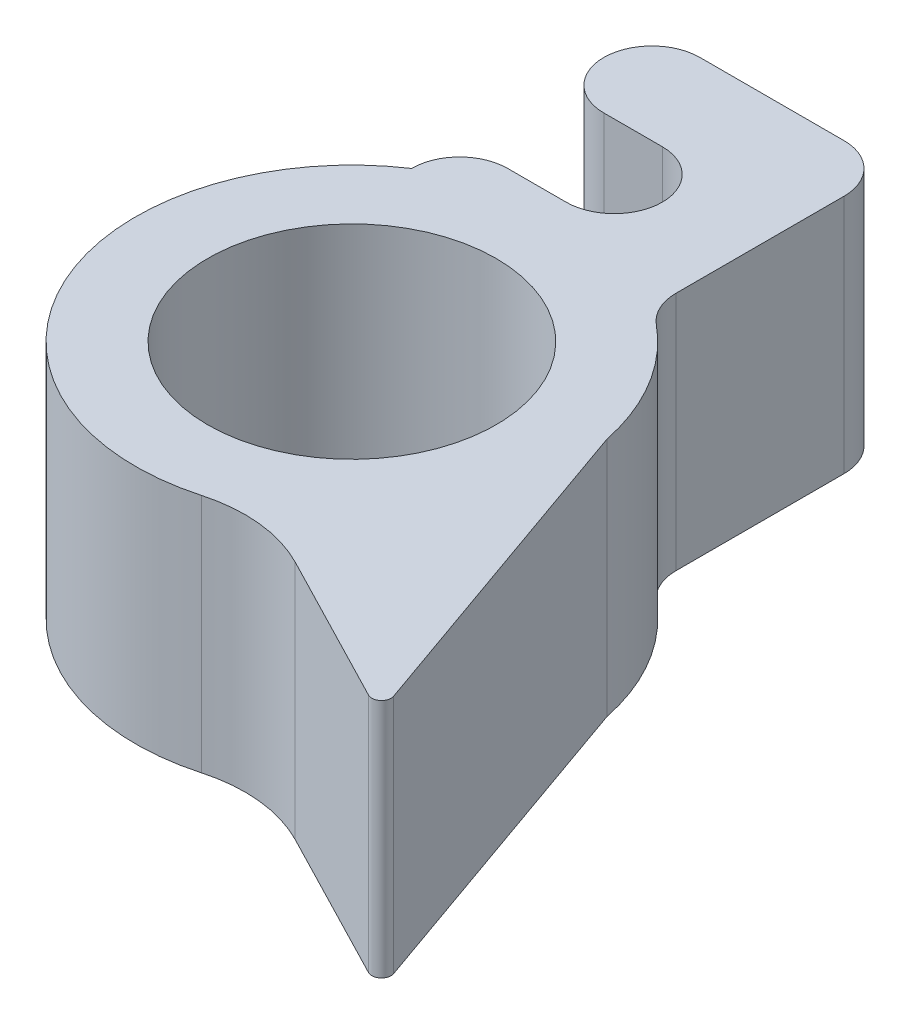
ISO-10303-21;
HEADER;
FILE_DESCRIPTION(('STEP AP214'),'2;1');
FILE_NAME('part.step','',(''),(''),'','','');
FILE_SCHEMA(('AUTOMOTIVE_DESIGN { 1 0 10303 214 1 1 1 1 }'));
ENDSEC;
DATA;
#1=APPLICATION_CONTEXT('core data for automotive mechanical design processes');
#2=APPLICATION_PROTOCOL_DEFINITION('international standard','automotive_design',2000,#1);
#3=PRODUCT_CONTEXT('',#1,'mechanical');
#4=PRODUCT('Part','Part','',(#3));
#5=PRODUCT_RELATED_PRODUCT_CATEGORY('part','',(#4));
#6=PRODUCT_DEFINITION_FORMATION('','',#4);
#7=PRODUCT_DEFINITION_CONTEXT('part definition',#1,'design');
#8=PRODUCT_DEFINITION('design','',#6,#7);
#9=PRODUCT_DEFINITION_SHAPE('','',#8);
#10=(LENGTH_UNIT() NAMED_UNIT(*) SI_UNIT(.MILLI.,.METRE.));
#11=(NAMED_UNIT(*) PLANE_ANGLE_UNIT() SI_UNIT($,.RADIAN.));
#12=(NAMED_UNIT(*) SI_UNIT($,.STERADIAN.) SOLID_ANGLE_UNIT());
#13=UNCERTAINTY_MEASURE_WITH_UNIT(LENGTH_MEASURE(1.E-05),#10,'distance_accuracy_value','');
#14=(GEOMETRIC_REPRESENTATION_CONTEXT(3) GLOBAL_UNCERTAINTY_ASSIGNED_CONTEXT((#13)) GLOBAL_UNIT_ASSIGNED_CONTEXT((#10,
#11,#12)) REPRESENTATION_CONTEXT('',''));
#15=CARTESIAN_POINT('',(0.,0.,0.));
#16=DIRECTION('',(0.,0.,1.));
#17=DIRECTION('',(1.,0.,0.));
#18=AXIS2_PLACEMENT_3D('',#15,#16,#17);
#19=CARTESIAN_POINT('',(0.,6.35,0.));
#20=DIRECTION('',(0.,-1.,0.));
#21=DIRECTION('',(0.,0.,-1.));
#22=AXIS2_PLACEMENT_3D('',#19,#20,#21);
#23=CYLINDRICAL_SURFACE('',#22,5.715);
#24=CARTESIAN_POINT('',(0.,6.35,0.));
#25=DIRECTION('',(0.,1.,0.));
#26=DIRECTION('',(0.,0.,1.));
#27=AXIS2_PLACEMENT_3D('',#24,#25,#26);
#28=CIRCLE('',#27,5.715);
#29=CARTESIAN_POINT('',(-3.175,6.35,-4.7519048812029));
#30=VERTEX_POINT('',#29);
#31=CARTESIAN_POINT('',(1.52784866845138,6.35,5.50698678465014));
#32=VERTEX_POINT('',#31);
#33=EDGE_CURVE('E169',#30,#32,#28,.T.);
#34=ORIENTED_EDGE('',*,*,#33,.F.);
#35=DIRECTION('',(0.,1.,0.));
#36=VECTOR('',#35,1.);
#37=CARTESIAN_POINT('',(-3.175,0.,-4.7519048812029));
#38=LINE('',#37,#36);
#39=CARTESIAN_POINT('',(-3.175,0.,-4.7519048812029));
#40=VERTEX_POINT('',#39);
#41=EDGE_CURVE('E164',#40,#30,#38,.T.);
#42=ORIENTED_EDGE('',*,*,#41,.F.);
#43=CARTESIAN_POINT('',(0.,0.,0.));
#44=DIRECTION('',(0.,1.,0.));
#45=DIRECTION('',(0.,0.,1.));
#46=AXIS2_PLACEMENT_3D('',#43,#44,#45);
#47=CIRCLE('',#46,5.715);
#48=CARTESIAN_POINT('',(1.52784866845138,0.,5.50698678465014));
#49=VERTEX_POINT('',#48);
#50=EDGE_CURVE('E167',#40,#49,#47,.T.);
#51=ORIENTED_EDGE('',*,*,#50,.T.);
#52=DIRECTION('',(0.,-1.,0.));
#53=VECTOR('',#52,1.);
#54=CARTESIAN_POINT('',(1.52784866845138,6.35,5.50698678465014));
#55=LINE('',#54,#53);
#56=EDGE_CURVE('E290',#49,#32,#55,.F.);
#57=ORIENTED_EDGE('',*,*,#56,.T.);
#58=EDGE_LOOP('',(#34,#42,#51,#57));
#59=FACE_BOUND('',#58,.T.);
#60=ADVANCED_FACE('F43',(#59),#23,.T.);
#61=CARTESIAN_POINT('',(5.59952568364628,0.,-1.1430385462379));
#62=VERTEX_POINT('',#61);
#63=CARTESIAN_POINT('',(3.63681818181818,0.,-4.40848936852486));
#64=VERTEX_POINT('',#63);
#65=EDGE_CURVE('E184',#62,#64,#47,.T.);
#66=ORIENTED_EDGE('',*,*,#65,.T.);
#67=DIRECTION('',(0.,-1.,0.));
#68=VECTOR('',#67,1.);
#69=CARTESIAN_POINT('',(3.63681818181818,6.35,-4.40848936852486));
#70=LINE('',#69,#68);
#71=CARTESIAN_POINT('',(3.63681818181818,6.35,-4.40848936852486));
#72=VERTEX_POINT('',#71);
#73=EDGE_CURVE('E278',#64,#72,#70,.F.);
#74=ORIENTED_EDGE('',*,*,#73,.T.);
#75=CARTESIAN_POINT('',(5.59952568364628,6.35,-1.1430385462379));
#76=VERTEX_POINT('',#75);
#77=EDGE_CURVE('E305',#76,#72,#28,.T.);
#78=ORIENTED_EDGE('',*,*,#77,.F.);
#79=DIRECTION('',(0.,-1.,0.));
#80=VECTOR('',#79,1.);
#81=CARTESIAN_POINT('',(5.59952568364628,6.35,-1.14303854623788));
#82=LINE('',#81,#80);
#83=EDGE_CURVE('E316',#62,#76,#82,.F.);
#84=ORIENTED_EDGE('',*,*,#83,.F.);
#85=EDGE_LOOP('',(#66,#74,#78,#84));
#86=FACE_BOUND('',#85,.T.);
#87=ADVANCED_FACE('F387',(#86),#23,.T.);
#88=CARTESIAN_POINT('',(0.,6.35,0.));
#89=DIRECTION('',(0.,1.,0.));
#90=DIRECTION('',(0.,0.,1.));
#91=AXIS2_PLACEMENT_3D('',#88,#89,#90);
#92=PLANE('',#91);
#93=DIRECTION('',(1.,0.,0.));
#94=VECTOR('',#93,1.);
#95=CARTESIAN_POINT('',(-3.175,6.35,-6.0219048812029));
#96=LINE('',#95,#94);
#97=CARTESIAN_POINT('',(-1.905,6.35,-6.0219048812029));
#98=VERTEX_POINT('',#97);
#99=CARTESIAN_POINT('',(-0.359574913694108,6.35,-6.0219048812029));
#100=VERTEX_POINT('',#99);
#101=EDGE_CURVE('E227',#98,#100,#96,.T.);
#102=ORIENTED_EDGE('',*,*,#101,.F.);
#103=CARTESIAN_POINT('',(-1.905,6.35,-4.7519048812029));
#104=DIRECTION('',(0.,1.,0.));
#105=DIRECTION('',(0.,0.,1.));
#106=AXIS2_PLACEMENT_3D('',#103,#104,#105);
#107=CIRCLE('',#106,1.27);
#108=EDGE_CURVE('E253',#98,#30,#107,.T.);
#109=ORIENTED_EDGE('',*,*,#108,.T.);
#110=ORIENTED_EDGE('',*,*,#33,.T.);
#111=CARTESIAN_POINT('',(2.54641444741897,6.35,9.17831130775024));
#112=DIRECTION('',(0.,1.,0.));
#113=DIRECTION('',(0.,0.,1.));
#114=AXIS2_PLACEMENT_3D('',#111,#112,#113);
#115=CIRCLE('',#114,3.81);
#116=CARTESIAN_POINT('',(4.29654066535961,6.35,5.79405980686015));
#117=VERTEX_POINT('',#116);
#118=EDGE_CURVE('E284',#32,#117,#115,.F.);
#119=ORIENTED_EDGE('',*,*,#118,.T.);
#120=DIRECTION('',(-0.888254987110259,0.,-0.459350713370246));
#121=VECTOR('',#120,1.);
#122=CARTESIAN_POINT('',(8.87692141777041,6.35,8.16275032552771));
#123=LINE('',#122,#121);
#124=CARTESIAN_POINT('',(8.30784884123121,6.35,7.868461075497));
#125=VERTEX_POINT('',#124);
#126=EDGE_CURVE('E173',#125,#117,#123,.T.);
#127=ORIENTED_EDGE('',*,*,#126,.F.);
#128=CARTESIAN_POINT('',(8.42452392242726,6.35,7.64284430877099));
#129=DIRECTION('',(0.,1.,0.));
#130=DIRECTION('',(0.,0.,1.));
#131=AXIS2_PLACEMENT_3D('',#128,#129,#130);
#132=CIRCLE('',#131,0.254);
#133=CARTESIAN_POINT('',(8.66409997571159,6.35,7.55846827726498));
#134=VERTEX_POINT('',#133);
#135=EDGE_CURVE('E299',#125,#134,#132,.T.);
#136=ORIENTED_EDGE('',*,*,#135,.T.);
#137=DIRECTION('',(0.332189100417359,0.,0.943212808206031));
#138=VECTOR('',#137,1.);
#139=CARTESIAN_POINT('',(5.08,6.35,-2.61817207226721));
#140=LINE('',#139,#138);
#141=EDGE_CURVE('E324',#76,#134,#140,.T.);
#142=ORIENTED_EDGE('',*,*,#141,.F.);
#143=ORIENTED_EDGE('',*,*,#77,.T.);
#144=CARTESIAN_POINT('',(4.445,6.35,-5.38815367264149));
#145=DIRECTION('',(0.,1.,0.));
#146=DIRECTION('',(0.,0.,1.));
#147=AXIS2_PLACEMENT_3D('',#144,#145,#146);
#148=CIRCLE('',#147,1.27);
#149=CARTESIAN_POINT('',(3.175,6.35,-5.38815367264149));
#150=VERTEX_POINT('',#149);
#151=EDGE_CURVE('E212',#72,#150,#148,.F.);
#152=ORIENTED_EDGE('',*,*,#151,.T.);
#153=DIRECTION('',(0.,0.,-1.));
#154=VECTOR('',#153,1.);
#155=CARTESIAN_POINT('',(3.175,6.35,-4.7519048812029));
#156=LINE('',#155,#154);
#157=CARTESIAN_POINT('',(3.175,6.35,-9.8319048812029));
#158=VERTEX_POINT('',#157);
#159=EDGE_CURVE('E342',#150,#158,#156,.T.);
#160=ORIENTED_EDGE('',*,*,#159,.T.);
#161=CARTESIAN_POINT('',(1.905,6.35,-9.8319048812029));
#162=DIRECTION('',(0.,1.,0.));
#163=DIRECTION('',(0.,0.,1.));
#164=AXIS2_PLACEMENT_3D('',#161,#162,#163);
#165=CIRCLE('',#164,1.27);
#166=CARTESIAN_POINT('',(1.905,6.35,-11.1019048812029));
#167=VERTEX_POINT('',#166);
#168=EDGE_CURVE('E262',#158,#167,#165,.T.);
#169=ORIENTED_EDGE('',*,*,#168,.T.);
#170=DIRECTION('',(-1.,0.,0.));
#171=VECTOR('',#170,1.);
#172=CARTESIAN_POINT('',(-3.175,6.35,-11.1019048812029));
#173=LINE('',#172,#171);
#174=CARTESIAN_POINT('',(-1.905,6.35,-11.1019048812029));
#175=VERTEX_POINT('',#174);
#176=EDGE_CURVE('E337',#167,#175,#173,.T.);
#177=ORIENTED_EDGE('',*,*,#176,.T.);
#178=CARTESIAN_POINT('',(-1.905,6.35,-9.8319048812029));
#179=DIRECTION('',(0.,1.,0.));
#180=DIRECTION('',(0.,0.,1.));
#181=AXIS2_PLACEMENT_3D('',#178,#179,#180);
#182=CIRCLE('',#181,1.27);
#183=CARTESIAN_POINT('',(-3.175,6.35,-9.8319048812029));
#184=VERTEX_POINT('',#183);
#185=EDGE_CURVE('E247',#175,#184,#182,.T.);
#186=ORIENTED_EDGE('',*,*,#185,.T.);
#187=CARTESIAN_POINT('',(-1.905,6.35,-9.8319048812029));
#188=DIRECTION('',(0.,1.,0.));
#189=DIRECTION('',(0.,0.,1.));
#190=AXIS2_PLACEMENT_3D('',#187,#188,#189);
#191=CIRCLE('',#190,1.27);
#192=CARTESIAN_POINT('',(-1.905,6.35,-8.5619048812029));
#193=VERTEX_POINT('',#192);
#194=EDGE_CURVE('E241',#184,#193,#191,.T.);
#195=ORIENTED_EDGE('',*,*,#194,.T.);
#196=DIRECTION('',(-1.,0.,0.));
#197=VECTOR('',#196,1.);
#198=CARTESIAN_POINT('',(-3.175,6.35,-8.5619048812029));
#199=LINE('',#198,#197);
#200=CARTESIAN_POINT('',(-0.359574913694109,6.35,-8.5619048812029));
#201=VERTEX_POINT('',#200);
#202=EDGE_CURVE('E233',#201,#193,#199,.T.);
#203=ORIENTED_EDGE('',*,*,#202,.F.);
#204=CARTESIAN_POINT('',(-0.359574913694109,6.35,-7.29190488120291));
#205=DIRECTION('',(0.,1.,0.));
#206=DIRECTION('',(0.,0.,1.));
#207=AXIS2_PLACEMENT_3D('',#204,#205,#206);
#208=CIRCLE('',#207,1.27);
#209=CARTESIAN_POINT('',(0.910425086305891,6.35,-7.2919048812029));
#210=VERTEX_POINT('',#209);
#211=EDGE_CURVE('E53',#201,#210,#208,.F.);
#212=ORIENTED_EDGE('',*,*,#211,.T.);
#213=CARTESIAN_POINT('',(-0.359574913694108,6.35,-7.2919048812029));
#214=DIRECTION('',(0.,1.,0.));
#215=DIRECTION('',(0.,0.,1.));
#216=AXIS2_PLACEMENT_3D('',#213,#214,#215);
#217=CIRCLE('',#216,1.27);
#218=EDGE_CURVE('E218',#210,#100,#217,.F.);
#219=ORIENTED_EDGE('',*,*,#218,.T.);
#220=EDGE_LOOP('',(#102,#109,#110,#119,#127,#136,#142,#143,#152,#160,#169,#177,#186,#195,#203,
#212,#219));
#221=FACE_BOUND('',#220,.T.);
#222=CARTESIAN_POINT('',(0.,6.35,0.));
#223=DIRECTION('',(0.,1.,0.));
#224=DIRECTION('',(0.,0.,1.));
#225=AXIS2_PLACEMENT_3D('',#222,#223,#224);
#226=CIRCLE('',#225,3.81);
#227=CARTESIAN_POINT('',(0.,6.35,3.81));
#228=VERTEX_POINT('',#227);
#229=EDGE_CURVE('E312',#228,#228,#226,.T.);
#230=ORIENTED_EDGE('',*,*,#229,.F.);
#231=EDGE_LOOP('',(#230));
#232=FACE_BOUND('',#231,.T.);
#233=ADVANCED_FACE('F365',(#221,#232),#92,.T.);
#234=CARTESIAN_POINT('',(0.,0.,0.));
#235=DIRECTION('',(0.,1.,0.));
#236=DIRECTION('',(0.,0.,1.));
#237=AXIS2_PLACEMENT_3D('',#234,#235,#236);
#238=PLANE('',#237);
#239=CARTESIAN_POINT('',(0.,0.,0.));
#240=DIRECTION('',(0.,1.,0.));
#241=DIRECTION('',(0.,0.,1.));
#242=AXIS2_PLACEMENT_3D('',#239,#240,#241);
#243=CIRCLE('',#242,3.81);
#244=CARTESIAN_POINT('',(0.,0.,3.81));
#245=VERTEX_POINT('',#244);
#246=EDGE_CURVE('E185',#245,#245,#243,.T.);
#247=ORIENTED_EDGE('',*,*,#246,.T.);
#248=EDGE_LOOP('',(#247));
#249=FACE_BOUND('',#248,.T.);
#250=ORIENTED_EDGE('',*,*,#50,.F.);
#251=CARTESIAN_POINT('',(-1.905,0.,-4.7519048812029));
#252=DIRECTION('',(0.,1.,0.));
#253=DIRECTION('',(0.,0.,1.));
#254=AXIS2_PLACEMENT_3D('',#251,#252,#253);
#255=CIRCLE('',#254,1.27);
#256=CARTESIAN_POINT('',(-1.905,0.,-6.0219048812029));
#257=VERTEX_POINT('',#256);
#258=EDGE_CURVE('E177',#40,#257,#255,.F.);
#259=ORIENTED_EDGE('',*,*,#258,.T.);
#260=DIRECTION('',(1.,0.,0.));
#261=VECTOR('',#260,1.);
#262=CARTESIAN_POINT('',(-3.175,0.,-6.0219048812029));
#263=LINE('',#262,#261);
#264=CARTESIAN_POINT('',(-0.359574913694108,0.,-6.0219048812029));
#265=VERTEX_POINT('',#264);
#266=EDGE_CURVE('E354',#257,#265,#263,.T.);
#267=ORIENTED_EDGE('',*,*,#266,.T.);
#268=CARTESIAN_POINT('',(-0.359574913694108,0.,-7.2919048812029));
#269=DIRECTION('',(0.,1.,0.));
#270=DIRECTION('',(0.,0.,1.));
#271=AXIS2_PLACEMENT_3D('',#268,#269,#270);
#272=CIRCLE('',#271,1.27);
#273=CARTESIAN_POINT('',(0.910425086305891,0.,-7.2919048812029));
#274=VERTEX_POINT('',#273);
#275=EDGE_CURVE('E60',#265,#274,#272,.T.);
#276=ORIENTED_EDGE('',*,*,#275,.T.);
#277=CARTESIAN_POINT('',(-0.359574913694109,0.,-7.29190488120291));
#278=DIRECTION('',(0.,1.,0.));
#279=DIRECTION('',(0.,0.,1.));
#280=AXIS2_PLACEMENT_3D('',#277,#278,#279);
#281=CIRCLE('',#280,1.27);
#282=CARTESIAN_POINT('',(-0.359574913694109,0.,-8.5619048812029));
#283=VERTEX_POINT('',#282);
#284=EDGE_CURVE('E11',#274,#283,#281,.T.);
#285=ORIENTED_EDGE('',*,*,#284,.T.);
#286=DIRECTION('',(-1.,0.,0.));
#287=VECTOR('',#286,1.);
#288=CARTESIAN_POINT('',(-3.175,0.,-8.5619048812029));
#289=LINE('',#288,#287);
#290=CARTESIAN_POINT('',(-1.905,0.,-8.5619048812029));
#291=VERTEX_POINT('',#290);
#292=EDGE_CURVE('E346',#283,#291,#289,.T.);
#293=ORIENTED_EDGE('',*,*,#292,.T.);
#294=CARTESIAN_POINT('',(-1.905,0.,-9.8319048812029));
#295=DIRECTION('',(0.,1.,0.));
#296=DIRECTION('',(0.,0.,1.));
#297=AXIS2_PLACEMENT_3D('',#294,#295,#296);
#298=CIRCLE('',#297,1.27);
#299=CARTESIAN_POINT('',(-3.175,0.,-9.8319048812029));
#300=VERTEX_POINT('',#299);
#301=EDGE_CURVE('E193',#291,#300,#298,.F.);
#302=ORIENTED_EDGE('',*,*,#301,.T.);
#303=CARTESIAN_POINT('',(-1.905,0.,-9.8319048812029));
#304=DIRECTION('',(0.,1.,0.));
#305=DIRECTION('',(0.,0.,1.));
#306=AXIS2_PLACEMENT_3D('',#303,#304,#305);
#307=CIRCLE('',#306,1.27);
#308=CARTESIAN_POINT('',(-1.905,0.,-11.1019048812029));
#309=VERTEX_POINT('',#308);
#310=EDGE_CURVE('E200',#300,#309,#307,.F.);
#311=ORIENTED_EDGE('',*,*,#310,.T.);
#312=DIRECTION('',(-1.,0.,0.));
#313=VECTOR('',#312,1.);
#314=CARTESIAN_POINT('',(-3.175,0.,-11.1019048812029));
#315=LINE('',#314,#313);
#316=CARTESIAN_POINT('',(1.905,0.,-11.1019048812029));
#317=VERTEX_POINT('',#316);
#318=EDGE_CURVE('E174',#317,#309,#315,.T.);
#319=ORIENTED_EDGE('',*,*,#318,.F.);
#320=CARTESIAN_POINT('',(1.905,0.,-9.8319048812029));
#321=DIRECTION('',(0.,1.,0.));
#322=DIRECTION('',(0.,0.,1.));
#323=AXIS2_PLACEMENT_3D('',#320,#321,#322);
#324=CIRCLE('',#323,1.27);
#325=CARTESIAN_POINT('',(3.175,0.,-9.8319048812029));
#326=VERTEX_POINT('',#325);
#327=EDGE_CURVE('E251',#317,#326,#324,.F.);
#328=ORIENTED_EDGE('',*,*,#327,.T.);
#329=DIRECTION('',(0.,0.,-1.));
#330=VECTOR('',#329,1.);
#331=CARTESIAN_POINT('',(3.175,0.,-4.7519048812029));
#332=LINE('',#331,#330);
#333=CARTESIAN_POINT('',(3.175,0.,-5.38815367264149));
#334=VERTEX_POINT('',#333);
#335=EDGE_CURVE('E341',#334,#326,#332,.T.);
#336=ORIENTED_EDGE('',*,*,#335,.F.);
#337=CARTESIAN_POINT('',(4.445,0.,-5.38815367264149));
#338=DIRECTION('',(0.,1.,0.));
#339=DIRECTION('',(0.,0.,1.));
#340=AXIS2_PLACEMENT_3D('',#337,#338,#339);
#341=CIRCLE('',#340,1.27);
#342=EDGE_CURVE('E215',#334,#64,#341,.T.);
#343=ORIENTED_EDGE('',*,*,#342,.T.);
#344=ORIENTED_EDGE('',*,*,#65,.F.);
#345=DIRECTION('',(0.332189100417359,0.,0.943212808206031));
#346=VECTOR('',#345,1.);
#347=CARTESIAN_POINT('',(5.08,0.,-2.61817207226721));
#348=LINE('',#347,#346);
#349=CARTESIAN_POINT('',(8.66409997571159,0.,7.55846827726498));
#350=VERTEX_POINT('',#349);
#351=EDGE_CURVE('E323',#62,#350,#348,.T.);
#352=ORIENTED_EDGE('',*,*,#351,.T.);
#353=CARTESIAN_POINT('',(8.42452392242726,0.,7.64284430877099));
#354=DIRECTION('',(0.,1.,0.));
#355=DIRECTION('',(0.,0.,1.));
#356=AXIS2_PLACEMENT_3D('',#353,#354,#355);
#357=CIRCLE('',#356,0.254);
#358=CARTESIAN_POINT('',(8.30784884123121,0.,7.868461075497));
#359=VERTEX_POINT('',#358);
#360=EDGE_CURVE('E293',#350,#359,#357,.F.);
#361=ORIENTED_EDGE('',*,*,#360,.T.);
#362=DIRECTION('',(-0.888254987110259,0.,-0.459350713370246));
#363=VECTOR('',#362,1.);
#364=CARTESIAN_POINT('',(8.87692141777041,0.,8.16275032552771));
#365=LINE('',#364,#363);
#366=CARTESIAN_POINT('',(4.29654066535961,0.,5.79405980686015));
#367=VERTEX_POINT('',#366);
#368=EDGE_CURVE('E328',#359,#367,#365,.T.);
#369=ORIENTED_EDGE('',*,*,#368,.T.);
#370=CARTESIAN_POINT('',(2.54641444741897,0.,9.17831130775024));
#371=DIRECTION('',(0.,1.,0.));
#372=DIRECTION('',(0.,0.,1.));
#373=AXIS2_PLACEMENT_3D('',#370,#371,#372);
#374=CIRCLE('',#373,3.81);
#375=EDGE_CURVE('E181',#367,#49,#374,.T.);
#376=ORIENTED_EDGE('',*,*,#375,.T.);
#377=EDGE_LOOP('',(#250,#259,#267,#276,#285,#293,#302,#311,#319,#328,#336,#343,#344,#352,#361,
#369,#376));
#378=FACE_BOUND('',#377,.T.);
#379=ADVANCED_FACE('F176',(#249,#378),#238,.F.);
#380=CARTESIAN_POINT('',(0.,0.,0.));
#381=DIRECTION('',(0.,1.,0.));
#382=DIRECTION('',(0.,0.,1.));
#383=AXIS2_PLACEMENT_3D('',#380,#381,#382);
#384=CYLINDRICAL_SURFACE('',#383,3.81);
#385=ORIENTED_EDGE('',*,*,#246,.F.);
#386=EDGE_LOOP('',(#385));
#387=FACE_BOUND('',#386,.T.);
#388=ORIENTED_EDGE('',*,*,#229,.T.);
#389=EDGE_LOOP('',(#388));
#390=FACE_BOUND('',#389,.T.);
#391=ADVANCED_FACE('F530',(#387,#390),#384,.F.);
#392=CARTESIAN_POINT('',(5.08,0.,-2.61817207226721));
#393=DIRECTION('',(-0.94321280820603,0.,0.332189100417359));
#394=DIRECTION('',(0.332189100417359,0.,0.943212808206031));
#395=AXIS2_PLACEMENT_3D('',#392,#393,#394);
#396=PLANE('',#395);
#397=ORIENTED_EDGE('',*,*,#141,.T.);
#398=DIRECTION('',(0.,1.,0.));
#399=VECTOR('',#398,1.);
#400=CARTESIAN_POINT('',(8.66409997571159,0.,7.55846827726498));
#401=LINE('',#400,#399);
#402=EDGE_CURVE('E296',#134,#350,#401,.F.);
#403=ORIENTED_EDGE('',*,*,#402,.T.);
#404=ORIENTED_EDGE('',*,*,#351,.F.);
#405=ORIENTED_EDGE('',*,*,#83,.T.);
#406=EDGE_LOOP('',(#397,#403,#404,#405));
#407=FACE_BOUND('',#406,.T.);
#408=ADVANCED_FACE('F383',(#407),#396,.F.);
#409=CARTESIAN_POINT('',(8.87692141777041,0.,8.16275032552771));
#410=DIRECTION('',(0.459350713370246,0.,-0.888254987110259));
#411=DIRECTION('',(-0.888254987110259,0.,-0.459350713370246));
#412=AXIS2_PLACEMENT_3D('',#409,#410,#411);
#413=PLANE('',#412);
#414=ORIENTED_EDGE('',*,*,#126,.T.);
#415=DIRECTION('',(0.,1.,0.));
#416=VECTOR('',#415,1.);
#417=CARTESIAN_POINT('',(4.29654066535961,0.,5.79405980686015));
#418=LINE('',#417,#416);
#419=EDGE_CURVE('E287',#117,#367,#418,.F.);
#420=ORIENTED_EDGE('',*,*,#419,.T.);
#421=ORIENTED_EDGE('',*,*,#368,.F.);
#422=DIRECTION('',(0.,1.,0.));
#423=VECTOR('',#422,1.);
#424=CARTESIAN_POINT('',(8.30784884123121,0.,7.868461075497));
#425=LINE('',#424,#423);
#426=EDGE_CURVE('E302',#359,#125,#425,.T.);
#427=ORIENTED_EDGE('',*,*,#426,.T.);
#428=EDGE_LOOP('',(#414,#420,#421,#427));
#429=FACE_BOUND('',#428,.T.);
#430=ADVANCED_FACE('F375',(#429),#413,.F.);
#431=CARTESIAN_POINT('',(8.42452392242726,0.,7.64284430877099));
#432=DIRECTION('',(0.,1.,0.));
#433=DIRECTION('',(0.,0.,1.));
#434=AXIS2_PLACEMENT_3D('',#431,#432,#433);
#435=CYLINDRICAL_SURFACE('',#434,0.254);
#436=ORIENTED_EDGE('',*,*,#360,.F.);
#437=ORIENTED_EDGE('',*,*,#402,.F.);
#438=ORIENTED_EDGE('',*,*,#135,.F.);
#439=ORIENTED_EDGE('',*,*,#426,.F.);
#440=EDGE_LOOP('',(#436,#437,#438,#439));
#441=FACE_BOUND('',#440,.T.);
#442=ADVANCED_FACE('F381',(#441),#435,.T.);
#443=CARTESIAN_POINT('',(2.54641444741897,6.35,9.17831130775024));
#444=DIRECTION('',(0.,-1.,0.));
#445=DIRECTION('',(0.,0.,-1.));
#446=AXIS2_PLACEMENT_3D('',#443,#444,#445);
#447=CYLINDRICAL_SURFACE('',#446,3.81);
#448=ORIENTED_EDGE('',*,*,#375,.F.);
#449=ORIENTED_EDGE('',*,*,#419,.F.);
#450=ORIENTED_EDGE('',*,*,#118,.F.);
#451=ORIENTED_EDGE('',*,*,#56,.F.);
#452=EDGE_LOOP('',(#448,#449,#450,#451));
#453=FACE_BOUND('',#452,.T.);
#454=ADVANCED_FACE('F372',(#453),#447,.F.);
#455=CARTESIAN_POINT('',(-3.175,0.,-11.1019048812029));
#456=DIRECTION('',(0.,0.,-1.));
#457=DIRECTION('',(-1.,0.,0.));
#458=AXIS2_PLACEMENT_3D('',#455,#456,#457);
#459=PLANE('',#458);
#460=ORIENTED_EDGE('',*,*,#318,.T.);
#461=DIRECTION('',(0.,1.,0.));
#462=VECTOR('',#461,1.);
#463=CARTESIAN_POINT('',(-1.905,0.,-11.1019048812029));
#464=LINE('',#463,#462);
#465=EDGE_CURVE('E209',#309,#175,#464,.T.);
#466=ORIENTED_EDGE('',*,*,#465,.T.);
#467=ORIENTED_EDGE('',*,*,#176,.F.);
#468=DIRECTION('',(0.,1.,0.));
#469=VECTOR('',#468,1.);
#470=CARTESIAN_POINT('',(1.905,0.,-11.1019048812029));
#471=LINE('',#470,#469);
#472=EDGE_CURVE('E206',#167,#317,#471,.F.);
#473=ORIENTED_EDGE('',*,*,#472,.T.);
#474=EDGE_LOOP('',(#460,#466,#467,#473));
#475=FACE_BOUND('',#474,.T.);
#476=ADVANCED_FACE('F403',(#475),#459,.T.);
#477=CARTESIAN_POINT('',(3.175,0.,-4.7519048812029));
#478=DIRECTION('',(1.,0.,0.));
#479=DIRECTION('',(0.,0.,-1.));
#480=AXIS2_PLACEMENT_3D('',#477,#478,#479);
#481=PLANE('',#480);
#482=ORIENTED_EDGE('',*,*,#159,.F.);
#483=DIRECTION('',(0.,-1.,0.));
#484=VECTOR('',#483,1.);
#485=CARTESIAN_POINT('',(3.175,0.,-5.38815367264149));
#486=LINE('',#485,#484);
#487=EDGE_CURVE('E271',#150,#334,#486,.T.);
#488=ORIENTED_EDGE('',*,*,#487,.T.);
#489=ORIENTED_EDGE('',*,*,#335,.T.);
#490=DIRECTION('',(0.,1.,0.));
#491=VECTOR('',#490,1.);
#492=CARTESIAN_POINT('',(3.175,0.,-9.8319048812029));
#493=LINE('',#492,#491);
#494=EDGE_CURVE('E274',#326,#158,#493,.T.);
#495=ORIENTED_EDGE('',*,*,#494,.T.);
#496=EDGE_LOOP('',(#482,#488,#489,#495));
#497=FACE_BOUND('',#496,.T.);
#498=ADVANCED_FACE('F393',(#497),#481,.T.);
#499=CARTESIAN_POINT('',(-3.175,0.,-8.5619048812029));
#500=DIRECTION('',(0.,0.,-1.));
#501=DIRECTION('',(-1.,0.,0.));
#502=AXIS2_PLACEMENT_3D('',#499,#500,#501);
#503=PLANE('',#502);
#504=ORIENTED_EDGE('',*,*,#292,.F.);
#505=DIRECTION('',(0.,1.,0.));
#506=VECTOR('',#505,1.);
#507=CARTESIAN_POINT('',(-0.359574913694109,6.35,-8.5619048812029));
#508=LINE('',#507,#506);
#509=EDGE_CURVE('E198',#283,#201,#508,.T.);
#510=ORIENTED_EDGE('',*,*,#509,.T.);
#511=ORIENTED_EDGE('',*,*,#202,.T.);
#512=DIRECTION('',(0.,1.,0.));
#513=VECTOR('',#512,1.);
#514=CARTESIAN_POINT('',(-1.905,0.,-8.5619048812029));
#515=LINE('',#514,#513);
#516=EDGE_CURVE('E192',#193,#291,#515,.F.);
#517=ORIENTED_EDGE('',*,*,#516,.T.);
#518=EDGE_LOOP('',(#504,#510,#511,#517));
#519=FACE_BOUND('',#518,.T.);
#520=ADVANCED_FACE('F410',(#519),#503,.F.);
#521=CARTESIAN_POINT('',(-3.175,0.,-6.0219048812029));
#522=DIRECTION('',(0.,0.,1.));
#523=DIRECTION('',(1.,0.,0.));
#524=AXIS2_PLACEMENT_3D('',#521,#522,#523);
#525=PLANE('',#524);
#526=ORIENTED_EDGE('',*,*,#266,.F.);
#527=DIRECTION('',(0.,1.,0.));
#528=VECTOR('',#527,1.);
#529=CARTESIAN_POINT('',(-1.905,6.35,-6.0219048812029));
#530=LINE('',#529,#528);
#531=EDGE_CURVE('E190',#257,#98,#530,.T.);
#532=ORIENTED_EDGE('',*,*,#531,.T.);
#533=ORIENTED_EDGE('',*,*,#101,.T.);
#534=DIRECTION('',(0.,1.,0.));
#535=VECTOR('',#534,1.);
#536=CARTESIAN_POINT('',(-0.359574913694108,0.,-6.0219048812029));
#537=LINE('',#536,#535);
#538=EDGE_CURVE('E267',#100,#265,#537,.F.);
#539=ORIENTED_EDGE('',*,*,#538,.T.);
#540=EDGE_LOOP('',(#526,#532,#533,#539));
#541=FACE_BOUND('',#540,.T.);
#542=ADVANCED_FACE('F361',(#541),#525,.F.);
#543=CARTESIAN_POINT('',(4.445,6.35,-5.38815367264149));
#544=DIRECTION('',(0.,-1.,0.));
#545=DIRECTION('',(0.,0.,-1.));
#546=AXIS2_PLACEMENT_3D('',#543,#544,#545);
#547=CYLINDRICAL_SURFACE('',#546,1.27);
#548=ORIENTED_EDGE('',*,*,#342,.F.);
#549=ORIENTED_EDGE('',*,*,#487,.F.);
#550=ORIENTED_EDGE('',*,*,#151,.F.);
#551=ORIENTED_EDGE('',*,*,#73,.F.);
#552=EDGE_LOOP('',(#548,#549,#550,#551));
#553=FACE_BOUND('',#552,.T.);
#554=ADVANCED_FACE('F397',(#553),#547,.F.);
#555=CARTESIAN_POINT('',(-1.905,0.,-4.7519048812029));
#556=DIRECTION('',(0.,-1.,0.));
#557=DIRECTION('',(0.,0.,-1.));
#558=AXIS2_PLACEMENT_3D('',#555,#556,#557);
#559=CYLINDRICAL_SURFACE('',#558,1.27);
#560=ORIENTED_EDGE('',*,*,#258,.F.);
#561=ORIENTED_EDGE('',*,*,#41,.T.);
#562=ORIENTED_EDGE('',*,*,#108,.F.);
#563=ORIENTED_EDGE('',*,*,#531,.F.);
#564=EDGE_LOOP('',(#560,#561,#562,#563));
#565=FACE_BOUND('',#564,.T.);
#566=ADVANCED_FACE('F188',(#565),#559,.T.);
#567=CARTESIAN_POINT('',(-0.359574913694109,0.,-7.29190488120291));
#568=DIRECTION('',(0.,-1.,0.));
#569=DIRECTION('',(0.,0.,-1.));
#570=AXIS2_PLACEMENT_3D('',#567,#568,#569);
#571=CYLINDRICAL_SURFACE('',#570,1.27);
#572=ORIENTED_EDGE('',*,*,#509,.F.);
#573=ORIENTED_EDGE('',*,*,#284,.F.);
#574=DIRECTION('',(0.,1.,0.));
#575=VECTOR('',#574,1.);
#576=CARTESIAN_POINT('',(0.910425086305891,0.,-7.29190488120291));
#577=LINE('',#576,#575);
#578=EDGE_CURVE('E224',#210,#274,#577,.F.);
#579=ORIENTED_EDGE('',*,*,#578,.F.);
#580=ORIENTED_EDGE('',*,*,#211,.F.);
#581=EDGE_LOOP('',(#572,#573,#579,#580));
#582=FACE_BOUND('',#581,.T.);
#583=ADVANCED_FACE('F430',(#582),#571,.F.);
#584=CARTESIAN_POINT('',(-0.359574913694108,0.,-7.2919048812029));
#585=DIRECTION('',(0.,-1.,0.));
#586=DIRECTION('',(0.,0.,-1.));
#587=AXIS2_PLACEMENT_3D('',#584,#585,#586);
#588=CYLINDRICAL_SURFACE('',#587,1.27);
#589=ORIENTED_EDGE('',*,*,#275,.F.);
#590=ORIENTED_EDGE('',*,*,#538,.F.);
#591=ORIENTED_EDGE('',*,*,#218,.F.);
#592=ORIENTED_EDGE('',*,*,#578,.T.);
#593=EDGE_LOOP('',(#589,#590,#591,#592));
#594=FACE_BOUND('',#593,.T.);
#595=ADVANCED_FACE('F364',(#594),#588,.F.);
#596=CARTESIAN_POINT('',(-1.905,0.,-9.8319048812029));
#597=DIRECTION('',(0.,1.,0.));
#598=DIRECTION('',(0.,0.,1.));
#599=AXIS2_PLACEMENT_3D('',#596,#597,#598);
#600=CYLINDRICAL_SURFACE('',#599,1.27);
#601=ORIENTED_EDGE('',*,*,#465,.F.);
#602=ORIENTED_EDGE('',*,*,#310,.F.);
#603=DIRECTION('',(0.,1.,0.));
#604=VECTOR('',#603,1.);
#605=CARTESIAN_POINT('',(-3.175,0.,-9.8319048812029));
#606=LINE('',#605,#604);
#607=EDGE_CURVE('E47',#184,#300,#606,.F.);
#608=ORIENTED_EDGE('',*,*,#607,.F.);
#609=ORIENTED_EDGE('',*,*,#185,.F.);
#610=EDGE_LOOP('',(#601,#602,#608,#609));
#611=FACE_BOUND('',#610,.T.);
#612=ADVANCED_FACE('F246',(#611),#600,.T.);
#613=CARTESIAN_POINT('',(-1.905,0.,-9.8319048812029));
#614=DIRECTION('',(0.,-1.,0.));
#615=DIRECTION('',(0.,0.,-1.));
#616=AXIS2_PLACEMENT_3D('',#613,#614,#615);
#617=CYLINDRICAL_SURFACE('',#616,1.27);
#618=ORIENTED_EDGE('',*,*,#301,.F.);
#619=ORIENTED_EDGE('',*,*,#516,.F.);
#620=ORIENTED_EDGE('',*,*,#194,.F.);
#621=ORIENTED_EDGE('',*,*,#607,.T.);
#622=EDGE_LOOP('',(#618,#619,#620,#621));
#623=FACE_BOUND('',#622,.T.);
#624=ADVANCED_FACE('F239',(#623),#617,.T.);
#625=CARTESIAN_POINT('',(1.905,0.,-9.8319048812029));
#626=DIRECTION('',(0.,1.,0.));
#627=DIRECTION('',(0.,0.,1.));
#628=AXIS2_PLACEMENT_3D('',#625,#626,#627);
#629=CYLINDRICAL_SURFACE('',#628,1.27);
#630=ORIENTED_EDGE('',*,*,#327,.F.);
#631=ORIENTED_EDGE('',*,*,#472,.F.);
#632=ORIENTED_EDGE('',*,*,#168,.F.);
#633=ORIENTED_EDGE('',*,*,#494,.F.);
#634=EDGE_LOOP('',(#630,#631,#632,#633));
#635=FACE_BOUND('',#634,.T.);
#636=ADVANCED_FACE('F45',(#635),#629,.T.);
#637=CLOSED_SHELL('',(#60,#87,#233,#379,#391,#408,#430,#442,#454,#476,#498,#520,#542,#554,#566,
#583,#595,#612,#624,#636));
#638=MANIFOLD_SOLID_BREP('B2',#637);
#639=ADVANCED_BREP_SHAPE_REPRESENTATION('',(#18,#638),#14);
#640=SHAPE_DEFINITION_REPRESENTATION(#9,#639);
ENDSEC;
END-ISO-10303-21;
